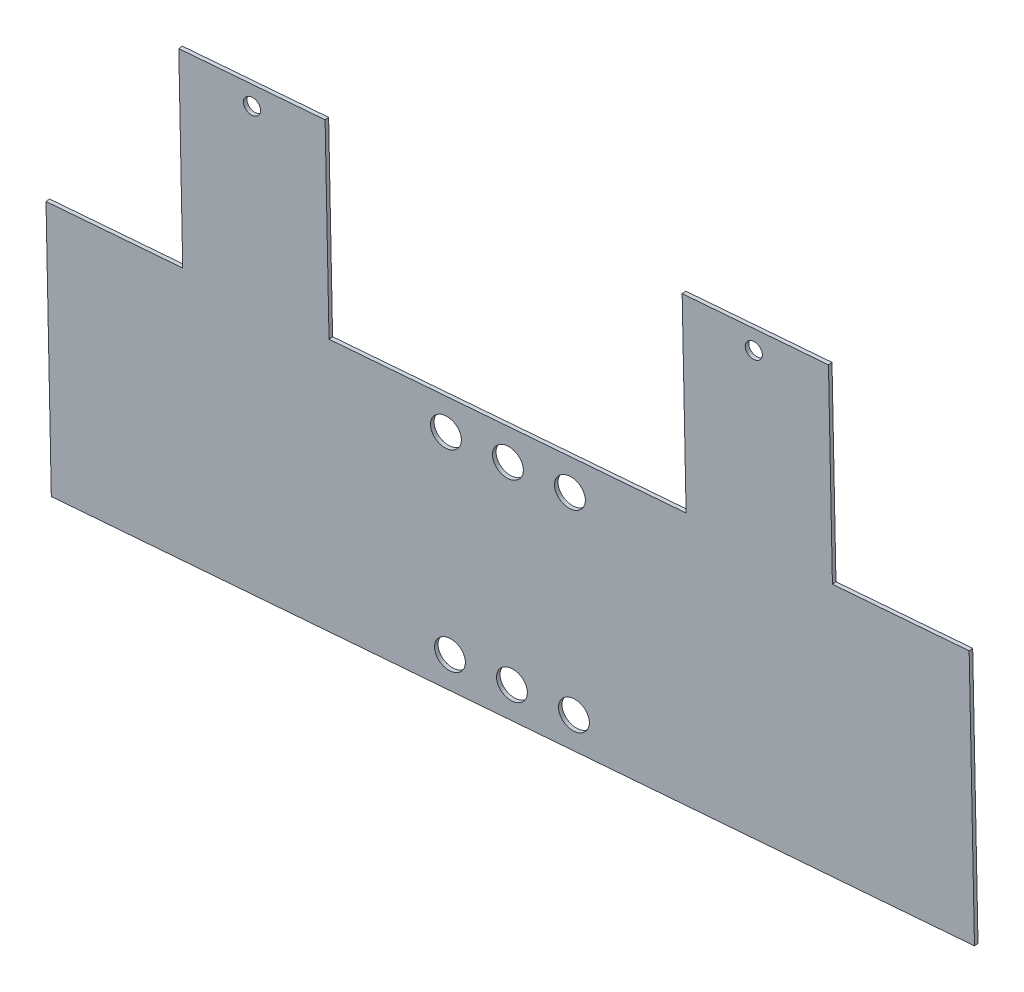
ISO-10303-21;
HEADER;
FILE_DESCRIPTION(('STEP AP214'),'2;1');
FILE_NAME('part.step','',(''),(''),'','','');
FILE_SCHEMA(('AUTOMOTIVE_DESIGN { 1 0 10303 214 1 1 1 1 }'));
ENDSEC;
DATA;
#1=APPLICATION_CONTEXT('core data for automotive mechanical design processes');
#2=APPLICATION_PROTOCOL_DEFINITION('international standard','automotive_design',2000,#1);
#3=PRODUCT_CONTEXT('',#1,'mechanical');
#4=PRODUCT('Part','Part','',(#3));
#5=PRODUCT_RELATED_PRODUCT_CATEGORY('part','',(#4));
#6=PRODUCT_DEFINITION_FORMATION('','',#4);
#7=PRODUCT_DEFINITION_CONTEXT('part definition',#1,'design');
#8=PRODUCT_DEFINITION('design','',#6,#7);
#9=PRODUCT_DEFINITION_SHAPE('','',#8);
#10=(LENGTH_UNIT() NAMED_UNIT(*) SI_UNIT(.MILLI.,.METRE.));
#11=(NAMED_UNIT(*) PLANE_ANGLE_UNIT() SI_UNIT($,.RADIAN.));
#12=(NAMED_UNIT(*) SI_UNIT($,.STERADIAN.) SOLID_ANGLE_UNIT());
#13=UNCERTAINTY_MEASURE_WITH_UNIT(LENGTH_MEASURE(1.E-05),#10,'distance_accuracy_value','');
#14=(GEOMETRIC_REPRESENTATION_CONTEXT(3) GLOBAL_UNCERTAINTY_ASSIGNED_CONTEXT((#13)) GLOBAL_UNIT_ASSIGNED_CONTEXT((#10,
#11,#12)) REPRESENTATION_CONTEXT('',''));
#15=CARTESIAN_POINT('',(0.,0.,0.));
#16=DIRECTION('',(0.,0.,1.));
#17=DIRECTION('',(1.,0.,0.));
#18=AXIS2_PLACEMENT_3D('',#15,#16,#17);
#19=CARTESIAN_POINT('',(-501.489956429642,-328.947406139133,240.499575413323));
#20=DIRECTION('',(0.99656940991837,0.00195950965151666,-0.0827379691367708));
#21=DIRECTION('',(-0.0827381279808112,0.,-0.996571323176736));
#22=AXIS2_PLACEMENT_3D('',#19,#20,#21);
#23=PLANE('',#22);
#24=DIRECTION('',(-0.00028055772663787,0.999793911631424,0.0202991515117986));
#25=VECTOR('',#24,1.);
#26=CARTESIAN_POINT('',(-501.439505510465,-328.959723900019,241.106959260261));
#27=LINE('',#26,#25);
#28=CARTESIAN_POINT('',(-501.439505510465,-328.959723900019,241.106959260261));
#29=VERTEX_POINT('',#28);
#30=CARTESIAN_POINT('',(-501.450907376476,-288.328099331318,241.9319167777));
#31=VERTEX_POINT('',#30);
#32=EDGE_CURVE('E153',#29,#31,#27,.T.);
#33=ORIENTED_EDGE('',*,*,#32,.T.);
#34=DIRECTION('',(0.082760694186997,-0.0202063006674291,0.99636457831008));
#35=VECTOR('',#34,1.);
#36=CARTESIAN_POINT('',(-501.501358295652,-288.315781570432,241.324532930762));
#37=LINE('',#36,#35);
#38=CARTESIAN_POINT('',(-501.501358295652,-288.315781570432,241.324532930762));
#39=VERTEX_POINT('',#38);
#40=EDGE_CURVE('E11',#39,#31,#37,.T.);
#41=ORIENTED_EDGE('',*,*,#40,.F.);
#42=DIRECTION('',(-0.00028055772663787,0.999793911631424,0.0202991515117986));
#43=VECTOR('',#42,1.);
#44=CARTESIAN_POINT('',(-501.489956429642,-328.947406139133,240.499575413323));
#45=LINE('',#44,#43);
#46=CARTESIAN_POINT('',(-501.489956429642,-328.947406139133,240.499575413323));
#47=VERTEX_POINT('',#46);
#48=EDGE_CURVE('E177',#47,#39,#45,.T.);
#49=ORIENTED_EDGE('',*,*,#48,.F.);
#50=DIRECTION('',(0.082760694186997,-0.0202063006674291,0.99636457831008));
#51=VECTOR('',#50,1.);
#52=CARTESIAN_POINT('',(-501.489956429642,-328.947406139133,240.499575413323));
#53=LINE('',#52,#51);
#54=EDGE_CURVE('E149',#47,#29,#53,.T.);
#55=ORIENTED_EDGE('',*,*,#54,.T.);
#56=EDGE_LOOP('',(#33,#41,#49,#55));
#57=FACE_BOUND('',#56,.T.);
#58=ADVANCED_FACE('F32',(#57),#23,.F.);
#59=CARTESIAN_POINT('',(-501.501358295652,-288.315781570432,241.324532930762));
#60=DIRECTION('',(0.00028055772663936,-0.999793911631424,-0.0202991515117988));
#61=DIRECTION('',(0.,0.0202991523106987,-0.999793950979634));
#62=AXIS2_PLACEMENT_3D('',#59,#60,#61);
#63=PLANE('',#62);
#64=DIRECTION('',(0.99656940991837,0.00195950965151815,-0.0827379691367705));
#65=VECTOR('',#64,1.);
#66=CARTESIAN_POINT('',(-501.450907376476,-288.328099331318,241.9319167777));
#67=LINE('',#66,#65);
#68=CARTESIAN_POINT('',(-481.580309912113,-288.289028668377,240.282204411082));
#69=VERTEX_POINT('',#68);
#70=EDGE_CURVE('E156',#31,#69,#67,.T.);
#71=ORIENTED_EDGE('',*,*,#70,.T.);
#72=DIRECTION('',(0.082760694186997,-0.0202063006674291,0.99636457831008));
#73=VECTOR('',#72,1.);
#74=CARTESIAN_POINT('',(-481.63076083129,-288.27671090749,239.674820564144));
#75=LINE('',#74,#73);
#76=CARTESIAN_POINT('',(-481.63076083129,-288.27671090749,239.674820564144));
#77=VERTEX_POINT('',#76);
#78=EDGE_CURVE('E40',#77,#69,#75,.T.);
#79=ORIENTED_EDGE('',*,*,#78,.F.);
#80=DIRECTION('',(0.99656940991837,0.00195950965151815,-0.0827379691367705));
#81=VECTOR('',#80,1.);
#82=CARTESIAN_POINT('',(-501.501358295652,-288.315781570432,241.324532930762));
#83=LINE('',#82,#81);
#84=EDGE_CURVE('E101',#39,#77,#83,.T.);
#85=ORIENTED_EDGE('',*,*,#84,.F.);
#86=ORIENTED_EDGE('',*,*,#40,.T.);
#87=EDGE_LOOP('',(#71,#79,#85,#86));
#88=FACE_BOUND('',#87,.T.);
#89=ADVANCED_FACE('F329',(#88),#63,.F.);
#90=CARTESIAN_POINT('',(-481.63076083129,-288.27671090749,239.674820564144));
#91=DIRECTION('',(0.99656940991837,0.001959509651517,-0.0827379691367708));
#92=DIRECTION('',(-0.0827381279808112,0.,-0.996571323176736));
#93=AXIS2_PLACEMENT_3D('',#90,#91,#92);
#94=PLANE('',#93);
#95=DIRECTION('',(-0.00028055772663823,0.999793911631424,0.0202991515117985));
#96=VECTOR('',#95,1.);
#97=CARTESIAN_POINT('',(-481.580309912113,-288.289028668377,240.282204411082));
#98=LINE('',#97,#96);
#99=CARTESIAN_POINT('',(-481.588787062269,-258.079904808935,240.895550396817));
#100=VERTEX_POINT('',#99);
#101=EDGE_CURVE('E159',#69,#100,#98,.T.);
#102=ORIENTED_EDGE('',*,*,#101,.T.);
#103=DIRECTION('',(0.082760694186997,-0.0202063006674291,0.99636457831008));
#104=VECTOR('',#103,1.);
#105=CARTESIAN_POINT('',(-481.639237981445,-258.067587048048,240.288166549879));
#106=LINE('',#105,#104);
#107=CARTESIAN_POINT('',(-481.639237981445,-258.067587048048,240.288166549879));
#108=VERTEX_POINT('',#107);
#109=EDGE_CURVE('E196',#108,#100,#106,.T.);
#110=ORIENTED_EDGE('',*,*,#109,.F.);
#111=DIRECTION('',(-0.00028055772663823,0.999793911631424,0.0202991515117985));
#112=VECTOR('',#111,1.);
#113=CARTESIAN_POINT('',(-481.63076083129,-288.27671090749,239.674820564144));
#114=LINE('',#113,#112);
#115=EDGE_CURVE('E204',#77,#108,#114,.T.);
#116=ORIENTED_EDGE('',*,*,#115,.F.);
#117=ORIENTED_EDGE('',*,*,#78,.T.);
#118=EDGE_LOOP('',(#102,#110,#116,#117));
#119=FACE_BOUND('',#118,.T.);
#120=ADVANCED_FACE('F202',(#119),#94,.F.);
#121=CARTESIAN_POINT('',(-481.639237981445,-258.067587048048,240.288166549879));
#122=DIRECTION('',(0.0002805577266377,-0.999793911631424,-0.0202991515117986));
#123=DIRECTION('',(0.,0.0202991523106986,-0.999793950979634));
#124=AXIS2_PLACEMENT_3D('',#121,#122,#123);
#125=PLANE('',#124);
#126=DIRECTION('',(0.99656940991837,0.00195950965151649,-0.0827379691367709));
#127=VECTOR('',#126,1.);
#128=CARTESIAN_POINT('',(-481.588787062269,-258.079904808935,240.895550396817));
#129=LINE('',#128,#127);
#130=CARTESIAN_POINT('',(-460.325982132251,-258.03809671101,239.130253087315));
#131=VERTEX_POINT('',#130);
#132=EDGE_CURVE('E161',#100,#131,#129,.T.);
#133=ORIENTED_EDGE('',*,*,#132,.T.);
#134=DIRECTION('',(0.082760694186997,-0.0202063006674291,0.99636457831008));
#135=VECTOR('',#134,1.);
#136=CARTESIAN_POINT('',(-460.376433051427,-258.025778950124,238.522869240377));
#137=LINE('',#136,#135);
#138=CARTESIAN_POINT('',(-460.376433051427,-258.025778950124,238.522869240377));
#139=VERTEX_POINT('',#138);
#140=EDGE_CURVE('E193',#139,#131,#137,.T.);
#141=ORIENTED_EDGE('',*,*,#140,.F.);
#142=DIRECTION('',(0.99656940991837,0.00195950965151649,-0.0827379691367709));
#143=VECTOR('',#142,1.);
#144=CARTESIAN_POINT('',(-481.639237981445,-258.067587048048,240.288166549879));
#145=LINE('',#144,#143);
#146=EDGE_CURVE('E220',#108,#139,#145,.T.);
#147=ORIENTED_EDGE('',*,*,#146,.F.);
#148=ORIENTED_EDGE('',*,*,#109,.T.);
#149=EDGE_LOOP('',(#133,#141,#147,#148));
#150=FACE_BOUND('',#149,.T.);
#151=ADVANCED_FACE('F211',(#150),#125,.F.);
#152=CARTESIAN_POINT('',(-460.367955901271,-288.234902809565,237.909523254642));
#153=DIRECTION('',(-0.99656940991837,-0.001959509651517,0.0827379691367708));
#154=DIRECTION('',(0.0827381279808112,0.,0.996571323176736));
#155=AXIS2_PLACEMENT_3D('',#152,#153,#154);
#156=PLANE('',#155);
#157=DIRECTION('',(0.00028055772663823,-0.999793911631424,-0.0202991515117985));
#158=VECTOR('',#157,1.);
#159=CARTESIAN_POINT('',(-460.317504982095,-288.247220570452,238.51690710158));
#160=LINE('',#159,#158);
#161=CARTESIAN_POINT('',(-460.317504982095,-288.247220570452,238.51690710158));
#162=VERTEX_POINT('',#161);
#163=EDGE_CURVE('E163',#131,#162,#160,.T.);
#164=ORIENTED_EDGE('',*,*,#163,.T.);
#165=DIRECTION('',(0.082760694186997,-0.0202063006674291,0.99636457831008));
#166=VECTOR('',#165,1.);
#167=CARTESIAN_POINT('',(-460.367955901271,-288.234902809565,237.909523254642));
#168=LINE('',#167,#166);
#169=CARTESIAN_POINT('',(-460.367955901271,-288.234902809565,237.909523254642));
#170=VERTEX_POINT('',#169);
#171=EDGE_CURVE('E190',#170,#162,#168,.T.);
#172=ORIENTED_EDGE('',*,*,#171,.F.);
#173=DIRECTION('',(0.00028055772663823,-0.999793911631424,-0.0202991515117985));
#174=VECTOR('',#173,1.);
#175=CARTESIAN_POINT('',(-460.367955901271,-288.234902809565,237.909523254642));
#176=LINE('',#175,#174);
#177=EDGE_CURVE('E217',#139,#170,#176,.T.);
#178=ORIENTED_EDGE('',*,*,#177,.F.);
#179=ORIENTED_EDGE('',*,*,#140,.T.);
#180=EDGE_LOOP('',(#164,#172,#178,#179));
#181=FACE_BOUND('',#180,.T.);
#182=ADVANCED_FACE('F215',(#181),#156,.F.);
#183=CARTESIAN_POINT('',(-460.367955901271,-288.234902809565,237.909523254642));
#184=DIRECTION('',(0.000280557726638657,-0.999793911631424,-0.0202991515117987));
#185=DIRECTION('',(0.,0.0202991523106986,-0.999793950979634));
#186=AXIS2_PLACEMENT_3D('',#183,#184,#185);
#187=PLANE('',#186);
#188=DIRECTION('',(0.99656940991837,0.00195950965151746,-0.0827379691367711));
#189=VECTOR('',#188,1.);
#190=CARTESIAN_POINT('',(-460.317504982095,-288.247220570452,238.51690710158));
#191=LINE('',#190,#189);
#192=CARTESIAN_POINT('',(-408.426135807645,-288.145188902897,234.208741048628));
#193=VERTEX_POINT('',#192);
#194=EDGE_CURVE('E165',#162,#193,#191,.T.);
#195=ORIENTED_EDGE('',*,*,#194,.T.);
#196=DIRECTION('',(0.082760694186997,-0.0202063006674291,0.99636457831008));
#197=VECTOR('',#196,1.);
#198=CARTESIAN_POINT('',(-408.476586726822,-288.132871142011,233.60135720169));
#199=LINE('',#198,#197);
#200=CARTESIAN_POINT('',(-408.476586726822,-288.132871142011,233.60135720169));
#201=VERTEX_POINT('',#200);
#202=EDGE_CURVE('E187',#201,#193,#199,.T.);
#203=ORIENTED_EDGE('',*,*,#202,.F.);
#204=DIRECTION('',(0.99656940991837,0.00195950965151746,-0.0827379691367711));
#205=VECTOR('',#204,1.);
#206=CARTESIAN_POINT('',(-460.367955901271,-288.234902809565,237.909523254642));
#207=LINE('',#206,#205);
#208=EDGE_CURVE('E219',#170,#201,#207,.T.);
#209=ORIENTED_EDGE('',*,*,#208,.F.);
#210=ORIENTED_EDGE('',*,*,#171,.T.);
#211=EDGE_LOOP('',(#195,#203,#209,#210));
#212=FACE_BOUND('',#211,.T.);
#213=ADVANCED_FACE('F342',(#212),#187,.F.);
#214=CARTESIAN_POINT('',(-408.476586726822,-288.132871142011,233.60135720169));
#215=DIRECTION('',(0.99656940991837,0.00195950965151708,-0.0827379691367708));
#216=DIRECTION('',(-0.0827381279808112,0.,-0.996571323176736));
#217=AXIS2_PLACEMENT_3D('',#214,#215,#216);
#218=PLANE('',#217);
#219=DIRECTION('',(-0.00028055772663823,0.999793911631424,0.0202991515117994));
#220=VECTOR('',#219,1.);
#221=CARTESIAN_POINT('',(-408.426135807645,-288.145188902897,234.208741048628));
#222=LINE('',#221,#220);
#223=CARTESIAN_POINT('',(-408.434612957801,-257.936065043456,234.822087034363));
#224=VERTEX_POINT('',#223);
#225=EDGE_CURVE('E167',#193,#224,#222,.T.);
#226=ORIENTED_EDGE('',*,*,#225,.T.);
#227=DIRECTION('',(0.082760694186997,-0.0202063006674291,0.99636457831008));
#228=VECTOR('',#227,1.);
#229=CARTESIAN_POINT('',(-408.485063876978,-257.923747282569,234.214703187425));
#230=LINE('',#229,#228);
#231=CARTESIAN_POINT('',(-408.485063876978,-257.923747282569,234.214703187425));
#232=VERTEX_POINT('',#231);
#233=EDGE_CURVE('E184',#232,#224,#230,.T.);
#234=ORIENTED_EDGE('',*,*,#233,.F.);
#235=DIRECTION('',(-0.00028055772663823,0.999793911631424,0.0202991515117994));
#236=VECTOR('',#235,1.);
#237=CARTESIAN_POINT('',(-408.476586726822,-288.132871142011,233.60135720169));
#238=LINE('',#237,#236);
#239=EDGE_CURVE('E222',#201,#232,#238,.T.);
#240=ORIENTED_EDGE('',*,*,#239,.F.);
#241=ORIENTED_EDGE('',*,*,#202,.T.);
#242=EDGE_LOOP('',(#226,#234,#240,#241));
#243=FACE_BOUND('',#242,.T.);
#244=ADVANCED_FACE('F345',(#243),#218,.F.);
#245=CARTESIAN_POINT('',(-408.485063876978,-257.923747282569,234.214703187425));
#246=DIRECTION('',(0.0002805577266377,-0.999793911631424,-0.0202991515117986));
#247=DIRECTION('',(0.,0.0202991523106986,-0.999793950979634));
#248=AXIS2_PLACEMENT_3D('',#245,#246,#247);
#249=PLANE('',#248);
#250=DIRECTION('',(0.99656940991837,0.00195950965151649,-0.0827379691367709));
#251=VECTOR('',#250,1.);
#252=CARTESIAN_POINT('',(-408.434612957801,-257.936065043456,234.822087034363));
#253=LINE('',#252,#251);
#254=CARTESIAN_POINT('',(-387.171808027783,-257.894256945531,233.056789724861));
#255=VERTEX_POINT('',#254);
#256=EDGE_CURVE('E169',#224,#255,#253,.T.);
#257=ORIENTED_EDGE('',*,*,#256,.T.);
#258=DIRECTION('',(0.082760694186997,-0.0202063006674291,0.99636457831008));
#259=VECTOR('',#258,1.);
#260=CARTESIAN_POINT('',(-387.222258946959,-257.881939184644,232.449405877923));
#261=LINE('',#260,#259);
#262=CARTESIAN_POINT('',(-387.222258946959,-257.881939184644,232.449405877923));
#263=VERTEX_POINT('',#262);
#264=EDGE_CURVE('E181',#263,#255,#261,.T.);
#265=ORIENTED_EDGE('',*,*,#264,.F.);
#266=DIRECTION('',(0.99656940991837,0.00195950965151649,-0.0827379691367709));
#267=VECTOR('',#266,1.);
#268=CARTESIAN_POINT('',(-408.485063876978,-257.923747282569,234.214703187425));
#269=LINE('',#268,#267);
#270=EDGE_CURVE('E228',#232,#263,#269,.T.);
#271=ORIENTED_EDGE('',*,*,#270,.F.);
#272=ORIENTED_EDGE('',*,*,#233,.T.);
#273=EDGE_LOOP('',(#257,#265,#271,#272));
#274=FACE_BOUND('',#273,.T.);
#275=ADVANCED_FACE('F234',(#274),#249,.F.);
#276=CARTESIAN_POINT('',(-387.213781796803,-288.091063044086,231.836059892188));
#277=DIRECTION('',(-0.99656940991837,-0.00195950965151708,0.0827379691367708));
#278=DIRECTION('',(0.0827381279808112,0.,0.996571323176736));
#279=AXIS2_PLACEMENT_3D('',#276,#277,#278);
#280=PLANE('',#279);
#281=DIRECTION('',(0.00028055772663823,-0.999793911631424,-0.0202991515117994));
#282=VECTOR('',#281,1.);
#283=CARTESIAN_POINT('',(-387.163330877627,-288.103380804973,232.443443739126));
#284=LINE('',#283,#282);
#285=CARTESIAN_POINT('',(-387.163330877627,-288.103380804973,232.443443739126));
#286=VERTEX_POINT('',#285);
#287=EDGE_CURVE('E171',#255,#286,#284,.T.);
#288=ORIENTED_EDGE('',*,*,#287,.T.);
#289=DIRECTION('',(0.082760694186997,-0.0202063006674291,0.99636457831008));
#290=VECTOR('',#289,1.);
#291=CARTESIAN_POINT('',(-387.213781796803,-288.091063044086,231.836059892188));
#292=LINE('',#291,#290);
#293=CARTESIAN_POINT('',(-387.213781796803,-288.091063044086,231.836059892188));
#294=VERTEX_POINT('',#293);
#295=EDGE_CURVE('E144',#294,#286,#292,.T.);
#296=ORIENTED_EDGE('',*,*,#295,.F.);
#297=DIRECTION('',(0.00028055772663823,-0.999793911631424,-0.0202991515117994));
#298=VECTOR('',#297,1.);
#299=CARTESIAN_POINT('',(-387.213781796803,-288.091063044086,231.836059892188));
#300=LINE('',#299,#298);
#301=EDGE_CURVE('E133',#263,#294,#300,.T.);
#302=ORIENTED_EDGE('',*,*,#301,.F.);
#303=ORIENTED_EDGE('',*,*,#264,.T.);
#304=EDGE_LOOP('',(#288,#296,#302,#303));
#305=FACE_BOUND('',#304,.T.);
#306=ADVANCED_FACE('F238',(#305),#280,.F.);
#307=CARTESIAN_POINT('',(-387.213781796803,-288.091063044086,231.836059892188));
#308=DIRECTION('',(0.00028055772663936,-0.999793911631424,-0.0202991515117988));
#309=DIRECTION('',(0.,0.0202991523106987,-0.999793950979634));
#310=AXIS2_PLACEMENT_3D('',#307,#308,#309);
#311=PLANE('',#310);
#312=DIRECTION('',(0.99656940991837,0.00195950965151815,-0.0827379691367705));
#313=VECTOR('',#312,1.);
#314=CARTESIAN_POINT('',(-387.163330877627,-288.103380804973,232.443443739126));
#315=LINE('',#314,#313);
#316=CARTESIAN_POINT('',(-367.292733413265,-288.064310142031,230.793731372508));
#317=VERTEX_POINT('',#316);
#318=EDGE_CURVE('E142',#286,#317,#315,.T.);
#319=ORIENTED_EDGE('',*,*,#318,.T.);
#320=DIRECTION('',(0.082760694186997,-0.0202063006674291,0.99636457831008));
#321=VECTOR('',#320,1.);
#322=CARTESIAN_POINT('',(-367.343184332441,-288.051992381144,230.18634752557));
#323=LINE('',#322,#321);
#324=CARTESIAN_POINT('',(-367.343184332441,-288.051992381144,230.18634752557));
#325=VERTEX_POINT('',#324);
#326=EDGE_CURVE('E139',#325,#317,#323,.T.);
#327=ORIENTED_EDGE('',*,*,#326,.F.);
#328=DIRECTION('',(0.99656940991837,0.00195950965151815,-0.0827379691367705));
#329=VECTOR('',#328,1.);
#330=CARTESIAN_POINT('',(-387.213781796803,-288.091063044086,231.836059892188));
#331=LINE('',#330,#329);
#332=EDGE_CURVE('E126',#294,#325,#331,.T.);
#333=ORIENTED_EDGE('',*,*,#332,.F.);
#334=ORIENTED_EDGE('',*,*,#295,.T.);
#335=EDGE_LOOP('',(#319,#327,#333,#334));
#336=FACE_BOUND('',#335,.T.);
#337=ADVANCED_FACE('F140',(#336),#311,.F.);
#338=CARTESIAN_POINT('',(-367.331782466431,-328.683616949845,229.361390008131));
#339=DIRECTION('',(-0.99656940991837,-0.00195950965151394,0.0827379691367708));
#340=DIRECTION('',(0.0827381279808113,0.,0.996571323176736));
#341=AXIS2_PLACEMENT_3D('',#338,#339,#340);
#342=PLANE('',#341);
#343=DIRECTION('',(0.000280557726635138,-0.999793911631424,-0.0202991515117986));
#344=VECTOR('',#343,1.);
#345=CARTESIAN_POINT('',(-367.281331547254,-328.695934710732,229.968773855068));
#346=LINE('',#345,#344);
#347=CARTESIAN_POINT('',(-367.281331547254,-328.695934710732,229.968773855068));
#348=VERTEX_POINT('',#347);
#349=EDGE_CURVE('E174',#317,#348,#346,.T.);
#350=ORIENTED_EDGE('',*,*,#349,.T.);
#351=DIRECTION('',(0.082760694186997,-0.0202063006674291,0.99636457831008));
#352=VECTOR('',#351,1.);
#353=CARTESIAN_POINT('',(-367.331782466431,-328.683616949845,229.361390008131));
#354=LINE('',#353,#352);
#355=CARTESIAN_POINT('',(-367.331782466431,-328.683616949845,229.361390008131));
#356=VERTEX_POINT('',#355);
#357=EDGE_CURVE('E145',#356,#348,#354,.T.);
#358=ORIENTED_EDGE('',*,*,#357,.F.);
#359=DIRECTION('',(0.000280557726635138,-0.999793911631424,-0.0202991515117986));
#360=VECTOR('',#359,1.);
#361=CARTESIAN_POINT('',(-367.331782466431,-328.683616949845,229.361390008131));
#362=LINE('',#361,#360);
#363=EDGE_CURVE('E130',#325,#356,#362,.T.);
#364=ORIENTED_EDGE('',*,*,#363,.F.);
#365=ORIENTED_EDGE('',*,*,#326,.T.);
#366=EDGE_LOOP('',(#350,#358,#364,#365));
#367=FACE_BOUND('',#366,.T.);
#368=ADVANCED_FACE('F147',(#367),#342,.F.);
#369=CARTESIAN_POINT('',(-501.489956429642,-328.947406139133,240.499575413323));
#370=DIRECTION('',(-0.00028055772663936,0.999793911631424,0.0202991515117988));
#371=DIRECTION('',(0.,-0.0202991523106987,0.999793950979634));
#372=AXIS2_PLACEMENT_3D('',#369,#370,#371);
#373=PLANE('',#372);
#374=DIRECTION('',(-0.99656940991837,-0.00195950965151815,0.0827379691367705));
#375=VECTOR('',#374,1.);
#376=CARTESIAN_POINT('',(-501.439505510465,-328.959723900019,241.106959260261));
#377=LINE('',#376,#375);
#378=EDGE_CURVE('E89',#348,#29,#377,.T.);
#379=ORIENTED_EDGE('',*,*,#378,.T.);
#380=ORIENTED_EDGE('',*,*,#54,.F.);
#381=DIRECTION('',(-0.99656940991837,-0.00195950965151794,0.0827379691367709));
#382=VECTOR('',#381,1.);
#383=CARTESIAN_POINT('',(-386.587283527019,-328.721478176367,230.960035357474));
#384=LINE('',#383,#382);
#385=EDGE_CURVE('E48',#356,#47,#384,.T.);
#386=ORIENTED_EDGE('',*,*,#385,.F.);
#387=ORIENTED_EDGE('',*,*,#357,.T.);
#388=EDGE_LOOP('',(#379,#380,#386,#387));
#389=FACE_BOUND('',#388,.T.);
#390=ADVANCED_FACE('F239',(#389),#373,.F.);
#391=CARTESIAN_POINT('',(16.9467758676456,-4.13761208613666,204.023991786853));
#392=DIRECTION('',(-0.0827606941869968,0.0202063006674291,-0.99636457831008));
#393=DIRECTION('',(-0.996568045750024,0.,0.0827775947341869));
#394=AXIS2_PLACEMENT_3D('',#391,#392,#393);
#395=PLANE('',#394);
#396=CARTESIAN_POINT('',(-471.054813760999,-261.10108861582,239.347476604441));
#397=DIRECTION('',(-0.0827606941869968,0.0202063006674291,-0.99636457831008));
#398=DIRECTION('',(-0.996568045750024,0.,0.0827775947341869));
#399=AXIS2_PLACEMENT_3D('',#396,#397,#398);
#400=CIRCLE('',#399,1.25000000000003);
#401=CARTESIAN_POINT('',(-472.300523818187,-261.10108861582,239.450948597859));
#402=VERTEX_POINT('',#401);
#403=EDGE_CURVE('E290',#402,#402,#400,.T.);
#404=ORIENTED_EDGE('',*,*,#403,.F.);
#405=EDGE_LOOP('',(#404));
#406=FACE_BOUND('',#405,.T.);
#407=CARTESIAN_POINT('',(-398.13117772993,-260.957702145591,233.293153155214));
#408=DIRECTION('',(-0.0827606941869968,0.0202063006674291,-0.99636457831008));
#409=DIRECTION('',(-0.996568045750024,0.,0.0827775947341869));
#410=AXIS2_PLACEMENT_3D('',#407,#408,#409);
#411=CIRCLE('',#410,1.24999999999998);
#412=CARTESIAN_POINT('',(-399.376887787118,-260.957702145591,233.396625148631));
#413=VERTEX_POINT('',#412);
#414=EDGE_CURVE('E284',#413,#413,#411,.T.);
#415=ORIENTED_EDGE('',*,*,#414,.F.);
#416=EDGE_LOOP('',(#415));
#417=FACE_BOUND('',#416,.T.);
#418=CARTESIAN_POINT('',(-443.473097110312,-293.200655525,236.40548570979));
#419=DIRECTION('',(0.0827606941869968,-0.0202063006674292,0.99636457831008));
#420=DIRECTION('',(-0.996566946014347,-0.00391901177606962,0.0826980257221201));
#421=AXIS2_PLACEMENT_3D('',#418,#419,#420);
#422=CIRCLE('',#421,2.24999999999997);
#423=CARTESIAN_POINT('',(-445.715372738845,-293.209473301496,236.591556267665));
#424=VERTEX_POINT('',#423);
#425=EDGE_CURVE('E275',#424,#424,#422,.T.);
#426=ORIENTED_EDGE('',*,*,#425,.T.);
#427=EDGE_LOOP('',(#426));
#428=FACE_BOUND('',#427,.T.);
#429=CARTESIAN_POINT('',(-434.464565062866,-293.182942453392,235.657572278879));
#430=DIRECTION('',(0.0827606941869968,-0.0202063006674292,0.99636457831008));
#431=DIRECTION('',(-0.996566946014347,-0.00391901177606962,0.0826980257221201));
#432=AXIS2_PLACEMENT_3D('',#429,#430,#431);
#433=CIRCLE('',#432,2.24999999999995);
#434=CARTESIAN_POINT('',(-436.706840691398,-293.191760229888,235.843642836754));
#435=VERTEX_POINT('',#434);
#436=EDGE_CURVE('E267',#435,#435,#433,.T.);
#437=ORIENTED_EDGE('',*,*,#436,.T.);
#438=EDGE_LOOP('',(#437));
#439=FACE_BOUND('',#438,.T.);
#440=CARTESIAN_POINT('',(-425.456033015419,-293.165229381784,234.909658847968));
#441=DIRECTION('',(0.0827606941869968,-0.0202063006674292,0.99636457831008));
#442=DIRECTION('',(-0.996566946014347,-0.00391901177606962,0.0826980257221201));
#443=AXIS2_PLACEMENT_3D('',#440,#441,#442);
#444=CIRCLE('',#443,2.24999999999995);
#445=CARTESIAN_POINT('',(-427.698308643951,-293.17404715828,235.095729405843));
#446=VERTEX_POINT('',#445);
#447=EDGE_CURVE('E268',#446,#446,#444,.T.);
#448=ORIENTED_EDGE('',*,*,#447,.T.);
#449=EDGE_LOOP('',(#448));
#450=FACE_BOUND('',#449,.T.);
#451=CARTESIAN_POINT('',(-443.464500821569,-323.834340975916,235.783519707498));
#452=DIRECTION('',(-0.0827606941869968,0.0202063006674291,-0.99636457831008));
#453=DIRECTION('',(-0.996568045750024,0.,0.0827775947341869));
#454=AXIS2_PLACEMENT_3D('',#451,#452,#453);
#455=CIRCLE('',#454,2.24999999999997);
#456=CARTESIAN_POINT('',(-445.706778924506,-323.834340975916,235.96976929565));
#457=VERTEX_POINT('',#456);
#458=EDGE_CURVE('E257',#457,#457,#455,.T.);
#459=ORIENTED_EDGE('',*,*,#458,.F.);
#460=EDGE_LOOP('',(#459));
#461=FACE_BOUND('',#460,.T.);
#462=CARTESIAN_POINT('',(-434.455968774122,-323.816627903961,235.035606276595));
#463=DIRECTION('',(-0.0827606941869968,0.0202063006674291,-0.99636457831008));
#464=DIRECTION('',(-0.996568045750024,0.,0.0827775947341869));
#465=AXIS2_PLACEMENT_3D('',#462,#463,#464);
#466=CIRCLE('',#465,2.24999999999995);
#467=CARTESIAN_POINT('',(-436.698246877059,-323.816627903961,235.221855864746));
#468=VERTEX_POINT('',#467);
#469=EDGE_CURVE('E249',#468,#468,#466,.T.);
#470=ORIENTED_EDGE('',*,*,#469,.F.);
#471=EDGE_LOOP('',(#470));
#472=FACE_BOUND('',#471,.T.);
#473=CARTESIAN_POINT('',(-425.447436726675,-323.798914832006,234.287692845691));
#474=DIRECTION('',(-0.0827606941869968,0.0202063006674291,-0.99636457831008));
#475=DIRECTION('',(-0.996568045750024,0.,0.0827775947341869));
#476=AXIS2_PLACEMENT_3D('',#473,#474,#475);
#477=CIRCLE('',#476,2.24999999999995);
#478=CARTESIAN_POINT('',(-427.689714829613,-323.798914832006,234.473942433843));
#479=VERTEX_POINT('',#478);
#480=EDGE_CURVE('E250',#479,#479,#477,.T.);
#481=ORIENTED_EDGE('',*,*,#480,.F.);
#482=EDGE_LOOP('',(#481));
#483=FACE_BOUND('',#482,.T.);
#484=ORIENTED_EDGE('',*,*,#48,.T.);
#485=ORIENTED_EDGE('',*,*,#84,.T.);
#486=ORIENTED_EDGE('',*,*,#115,.T.);
#487=ORIENTED_EDGE('',*,*,#146,.T.);
#488=ORIENTED_EDGE('',*,*,#177,.T.);
#489=ORIENTED_EDGE('',*,*,#208,.T.);
#490=ORIENTED_EDGE('',*,*,#239,.T.);
#491=ORIENTED_EDGE('',*,*,#270,.T.);
#492=ORIENTED_EDGE('',*,*,#301,.T.);
#493=ORIENTED_EDGE('',*,*,#332,.T.);
#494=ORIENTED_EDGE('',*,*,#363,.T.);
#495=ORIENTED_EDGE('',*,*,#385,.T.);
#496=EDGE_LOOP('',(#484,#485,#486,#487,#488,#489,#490,#491,#492,#493,#494,#495));
#497=FACE_BOUND('',#496,.T.);
#498=ADVANCED_FACE('F128',(#406,#417,#428,#439,#450,#461,#472,#483,#497),#395,.T.);
#499=CARTESIAN_POINT('',(16.997226786822,-4.14992984702352,204.631375633791));
#500=DIRECTION('',(-0.0827606941869968,0.0202063006674291,-0.99636457831008));
#501=DIRECTION('',(-0.996568045750024,0.,0.0827775947341869));
#502=AXIS2_PLACEMENT_3D('',#499,#500,#501);
#503=PLANE('',#502);
#504=CARTESIAN_POINT('',(-471.004362841823,-261.113406376707,239.954860451379));
#505=DIRECTION('',(-0.0827606941869968,0.0202063006674291,-0.99636457831008));
#506=DIRECTION('',(-0.996568045750024,0.,0.0827775947341869));
#507=AXIS2_PLACEMENT_3D('',#504,#505,#506);
#508=CIRCLE('',#507,1.25000000000003);
#509=CARTESIAN_POINT('',(-472.25007289901,-261.113406376707,240.058332444796));
#510=VERTEX_POINT('',#509);
#511=EDGE_CURVE('E287',#510,#510,#508,.F.);
#512=ORIENTED_EDGE('',*,*,#511,.F.);
#513=EDGE_LOOP('',(#512));
#514=FACE_BOUND('',#513,.T.);
#515=CARTESIAN_POINT('',(-398.080726810754,-260.970019906478,233.900537002151));
#516=DIRECTION('',(-0.0827606941869968,0.0202063006674291,-0.99636457831008));
#517=DIRECTION('',(-0.996568045750024,0.,0.0827775947341869));
#518=AXIS2_PLACEMENT_3D('',#515,#516,#517);
#519=CIRCLE('',#518,1.24999999999998);
#520=CARTESIAN_POINT('',(-399.326436867941,-260.970019906478,234.004008995569));
#521=VERTEX_POINT('',#520);
#522=EDGE_CURVE('E271',#521,#521,#519,.F.);
#523=ORIENTED_EDGE('',*,*,#522,.F.);
#524=EDGE_LOOP('',(#523));
#525=FACE_BOUND('',#524,.T.);
#526=CARTESIAN_POINT('',(-443.422646191136,-293.212973285887,237.012869556728));
#527=DIRECTION('',(-0.0827606941869968,0.0202063006674291,-0.99636457831008));
#528=DIRECTION('',(-0.996568045750024,0.,0.0827775947341869));
#529=AXIS2_PLACEMENT_3D('',#526,#527,#528);
#530=CIRCLE('',#529,2.24999999999997);
#531=CARTESIAN_POINT('',(-445.664924294074,-293.212973285887,237.19911914488));
#532=VERTEX_POINT('',#531);
#533=EDGE_CURVE('E253',#532,#532,#530,.T.);
#534=ORIENTED_EDGE('',*,*,#533,.T.);
#535=EDGE_LOOP('',(#534));
#536=FACE_BOUND('',#535,.T.);
#537=CARTESIAN_POINT('',(-434.414114143689,-293.195260214279,236.264956125817));
#538=DIRECTION('',(-0.0827606941869968,0.0202063006674291,-0.99636457831008));
#539=DIRECTION('',(-0.996568045750024,0.,0.0827775947341869));
#540=AXIS2_PLACEMENT_3D('',#537,#538,#539);
#541=CIRCLE('',#540,2.24999999999995);
#542=CARTESIAN_POINT('',(-436.656392246627,-293.195260214279,236.451205713969));
#543=VERTEX_POINT('',#542);
#544=EDGE_CURVE('E272',#543,#543,#541,.T.);
#545=ORIENTED_EDGE('',*,*,#544,.T.);
#546=EDGE_LOOP('',(#545));
#547=FACE_BOUND('',#546,.T.);
#548=CARTESIAN_POINT('',(-425.405582096243,-293.177547142671,235.517042694906));
#549=DIRECTION('',(-0.0827606941869968,0.0202063006674291,-0.99636457831008));
#550=DIRECTION('',(-0.996568045750024,0.,0.0827775947341869));
#551=AXIS2_PLACEMENT_3D('',#548,#549,#550);
#552=CIRCLE('',#551,2.24999999999995);
#553=CARTESIAN_POINT('',(-427.64786019918,-293.177547142671,235.703292283058));
#554=VERTEX_POINT('',#553);
#555=EDGE_CURVE('E264',#554,#554,#552,.T.);
#556=ORIENTED_EDGE('',*,*,#555,.T.);
#557=EDGE_LOOP('',(#556));
#558=FACE_BOUND('',#557,.T.);
#559=CARTESIAN_POINT('',(-443.414049902392,-323.846658736803,236.390903554436));
#560=DIRECTION('',(-0.0827606941869968,0.0202063006674291,-0.99636457831008));
#561=DIRECTION('',(-0.996568045750024,0.,0.0827775947341869));
#562=AXIS2_PLACEMENT_3D('',#559,#560,#561);
#563=CIRCLE('',#562,2.24999999999997);
#564=CARTESIAN_POINT('',(-445.65632800533,-323.846658736803,236.577153142588));
#565=VERTEX_POINT('',#564);
#566=EDGE_CURVE('E157',#565,#565,#563,.F.);
#567=ORIENTED_EDGE('',*,*,#566,.F.);
#568=EDGE_LOOP('',(#567));
#569=FACE_BOUND('',#568,.T.);
#570=CARTESIAN_POINT('',(-434.405517854946,-323.828945664848,235.642990123532));
#571=DIRECTION('',(-0.0827606941869968,0.0202063006674291,-0.99636457831008));
#572=DIRECTION('',(-0.996568045750024,0.,0.0827775947341869));
#573=AXIS2_PLACEMENT_3D('',#570,#571,#572);
#574=CIRCLE('',#573,2.24999999999995);
#575=CARTESIAN_POINT('',(-436.647795957883,-323.828945664848,235.829239711684));
#576=VERTEX_POINT('',#575);
#577=EDGE_CURVE('E254',#576,#576,#574,.F.);
#578=ORIENTED_EDGE('',*,*,#577,.F.);
#579=EDGE_LOOP('',(#578));
#580=FACE_BOUND('',#579,.T.);
#581=CARTESIAN_POINT('',(-425.396985807499,-323.811232592893,234.895076692629));
#582=DIRECTION('',(-0.0827606941869968,0.0202063006674291,-0.99636457831008));
#583=DIRECTION('',(-0.996568045750024,0.,0.0827775947341869));
#584=AXIS2_PLACEMENT_3D('',#581,#582,#583);
#585=CIRCLE('',#584,2.24999999999995);
#586=CARTESIAN_POINT('',(-427.639263910436,-323.811232592893,235.08132628078));
#587=VERTEX_POINT('',#586);
#588=EDGE_CURVE('E246',#587,#587,#585,.F.);
#589=ORIENTED_EDGE('',*,*,#588,.F.);
#590=EDGE_LOOP('',(#589));
#591=FACE_BOUND('',#590,.T.);
#592=ORIENTED_EDGE('',*,*,#32,.F.);
#593=ORIENTED_EDGE('',*,*,#378,.F.);
#594=ORIENTED_EDGE('',*,*,#349,.F.);
#595=ORIENTED_EDGE('',*,*,#318,.F.);
#596=ORIENTED_EDGE('',*,*,#287,.F.);
#597=ORIENTED_EDGE('',*,*,#256,.F.);
#598=ORIENTED_EDGE('',*,*,#225,.F.);
#599=ORIENTED_EDGE('',*,*,#194,.F.);
#600=ORIENTED_EDGE('',*,*,#163,.F.);
#601=ORIENTED_EDGE('',*,*,#132,.F.);
#602=ORIENTED_EDGE('',*,*,#101,.F.);
#603=ORIENTED_EDGE('',*,*,#70,.F.);
#604=EDGE_LOOP('',(#592,#593,#594,#595,#596,#597,#598,#599,#600,#601,#602,#603));
#605=FACE_BOUND('',#604,.T.);
#606=ADVANCED_FACE('F206',(#514,#525,#536,#547,#558,#569,#580,#591,#605),#503,.F.);
#607=CARTESIAN_POINT('',(-424.870299974821,-323.939824702915,241.235902041343));
#608=DIRECTION('',(-0.0827606941869969,0.0202063006674291,-0.99636457831008));
#609=DIRECTION('',(-0.996568045750024,0.,0.0827775947341869));
#610=AXIS2_PLACEMENT_3D('',#607,#608,#609);
#611=CYLINDRICAL_SURFACE('',#610,2.24999999999995);
#612=ORIENTED_EDGE('',*,*,#588,.T.);
#613=EDGE_LOOP('',(#612));
#614=FACE_BOUND('',#613,.T.);
#615=ORIENTED_EDGE('',*,*,#480,.T.);
#616=EDGE_LOOP('',(#615));
#617=FACE_BOUND('',#616,.T.);
#618=ADVANCED_FACE('F313',(#614,#617),#611,.F.);
#619=CARTESIAN_POINT('',(-433.878832022268,-323.95753777487,241.983815472246));
#620=DIRECTION('',(-0.0827606941869969,0.0202063006674291,-0.99636457831008));
#621=DIRECTION('',(-0.996568045750024,0.,0.0827775947341869));
#622=AXIS2_PLACEMENT_3D('',#619,#620,#621);
#623=CYLINDRICAL_SURFACE('',#622,2.24999999999995);
#624=ORIENTED_EDGE('',*,*,#577,.T.);
#625=EDGE_LOOP('',(#624));
#626=FACE_BOUND('',#625,.T.);
#627=ORIENTED_EDGE('',*,*,#469,.T.);
#628=EDGE_LOOP('',(#627));
#629=FACE_BOUND('',#628,.T.);
#630=ADVANCED_FACE('F315',(#626,#629),#623,.F.);
#631=CARTESIAN_POINT('',(-442.887364069714,-323.975250846825,242.73172890315));
#632=DIRECTION('',(-0.0827606941869969,0.0202063006674291,-0.99636457831008));
#633=DIRECTION('',(-0.996568045750024,0.,0.0827775947341869));
#634=AXIS2_PLACEMENT_3D('',#631,#632,#633);
#635=CYLINDRICAL_SURFACE('',#634,2.24999999999997);
#636=ORIENTED_EDGE('',*,*,#566,.T.);
#637=EDGE_LOOP('',(#636));
#638=FACE_BOUND('',#637,.T.);
#639=ORIENTED_EDGE('',*,*,#458,.T.);
#640=EDGE_LOOP('',(#639));
#641=FACE_BOUND('',#640,.T.);
#642=ADVANCED_FACE('F322',(#638,#641),#635,.F.);
#643=CARTESIAN_POINT('',(-424.878896263565,-293.306139252693,241.85786804362));
#644=DIRECTION('',(-0.0827606941869969,0.0202063006674292,-0.99636457831008));
#645=DIRECTION('',(-0.996568045750024,0.,0.0827775947341869));
#646=AXIS2_PLACEMENT_3D('',#643,#644,#645);
#647=CYLINDRICAL_SURFACE('',#646,2.24999999999995);
#648=ORIENTED_EDGE('',*,*,#555,.F.);
#649=EDGE_LOOP('',(#648));
#650=FACE_BOUND('',#649,.T.);
#651=ORIENTED_EDGE('',*,*,#447,.F.);
#652=EDGE_LOOP('',(#651));
#653=FACE_BOUND('',#652,.T.);
#654=ADVANCED_FACE('F407',(#650,#653),#647,.F.);
#655=CARTESIAN_POINT('',(-433.887428311011,-293.323852324301,242.605781474531));
#656=DIRECTION('',(-0.0827606941869969,0.0202063006674292,-0.99636457831008));
#657=DIRECTION('',(-0.996568045750024,0.,0.0827775947341869));
#658=AXIS2_PLACEMENT_3D('',#655,#656,#657);
#659=CYLINDRICAL_SURFACE('',#658,2.24999999999995);
#660=ORIENTED_EDGE('',*,*,#544,.F.);
#661=EDGE_LOOP('',(#660));
#662=FACE_BOUND('',#661,.T.);
#663=ORIENTED_EDGE('',*,*,#436,.F.);
#664=EDGE_LOOP('',(#663));
#665=FACE_BOUND('',#664,.T.);
#666=ADVANCED_FACE('F399',(#662,#665),#659,.F.);
#667=CARTESIAN_POINT('',(-442.895960358458,-293.341565395908,243.353694905442));
#668=DIRECTION('',(-0.0827606941869969,0.0202063006674292,-0.99636457831008));
#669=DIRECTION('',(-0.996568045750024,0.,0.0827775947341869));
#670=AXIS2_PLACEMENT_3D('',#667,#668,#669);
#671=CYLINDRICAL_SURFACE('',#670,2.24999999999997);
#672=ORIENTED_EDGE('',*,*,#533,.F.);
#673=EDGE_LOOP('',(#672));
#674=FACE_BOUND('',#673,.T.);
#675=ORIENTED_EDGE('',*,*,#425,.F.);
#676=EDGE_LOOP('',(#675));
#677=FACE_BOUND('',#676,.T.);
#678=ADVANCED_FACE('F392',(#674,#677),#671,.F.);
#679=CARTESIAN_POINT('',(-397.788123570377,-261.041459967601,237.423217751437));
#680=DIRECTION('',(-0.0827606941869968,0.0202063006674291,-0.99636457831008));
#681=DIRECTION('',(-0.996568045750024,0.,0.0827775947341869));
#682=AXIS2_PLACEMENT_3D('',#679,#680,#681);
#683=CYLINDRICAL_SURFACE('',#682,1.24999999999998);
#684=ORIENTED_EDGE('',*,*,#522,.T.);
#685=EDGE_LOOP('',(#684));
#686=FACE_BOUND('',#685,.T.);
#687=ORIENTED_EDGE('',*,*,#414,.T.);
#688=EDGE_LOOP('',(#687));
#689=FACE_BOUND('',#688,.T.);
#690=ADVANCED_FACE('F382',(#686,#689),#683,.F.);
#691=CARTESIAN_POINT('',(-470.711759601446,-261.18484643783,243.477541200664));
#692=DIRECTION('',(-0.0827606941869968,0.0202063006674291,-0.99636457831008));
#693=DIRECTION('',(-0.996568045750024,0.,0.0827775947341869));
#694=AXIS2_PLACEMENT_3D('',#691,#692,#693);
#695=CYLINDRICAL_SURFACE('',#694,1.25000000000003);
#696=ORIENTED_EDGE('',*,*,#511,.T.);
#697=EDGE_LOOP('',(#696));
#698=FACE_BOUND('',#697,.T.);
#699=ORIENTED_EDGE('',*,*,#403,.T.);
#700=EDGE_LOOP('',(#699));
#701=FACE_BOUND('',#700,.T.);
#702=ADVANCED_FACE('F294',(#698,#701),#695,.F.);
#703=CLOSED_SHELL('',(#58,#89,#120,#151,#182,#213,#244,#275,#306,#337,#368,#390,#498,#606,#618,
#630,#642,#654,#666,#678,#690,#702));
#704=MANIFOLD_SOLID_BREP('B2',#703);
#705=ADVANCED_BREP_SHAPE_REPRESENTATION('',(#18,#704),#14);
#706=SHAPE_DEFINITION_REPRESENTATION(#9,#705);
ENDSEC;
END-ISO-10303-21;
